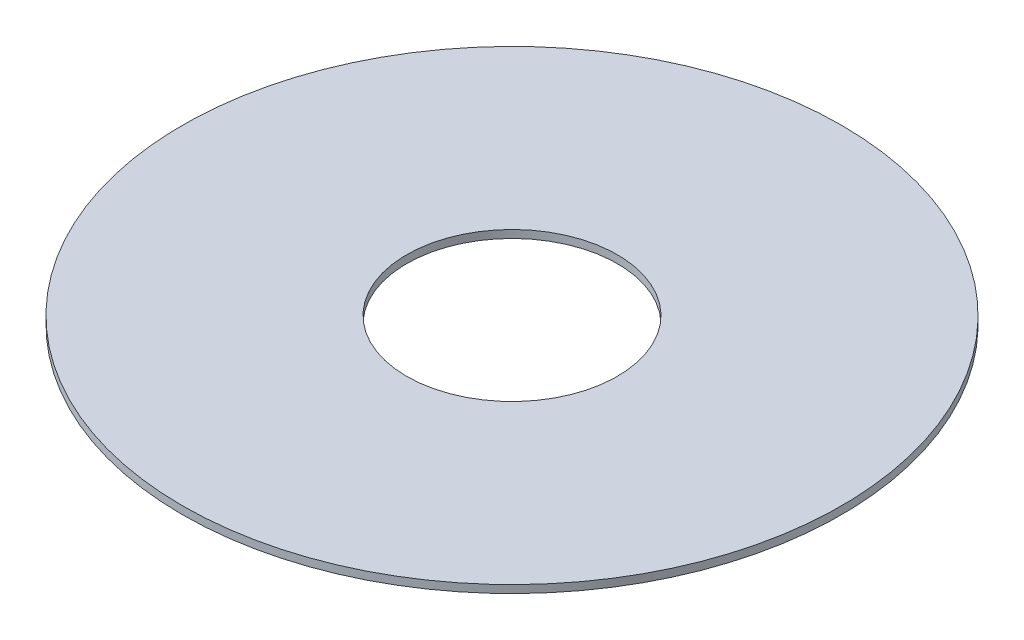
ISO-10303-21;
HEADER;
FILE_DESCRIPTION(('STEP AP214'),'2;1');
FILE_NAME('part.step','',(''),(''),'','','');
FILE_SCHEMA(('AUTOMOTIVE_DESIGN { 1 0 10303 214 1 1 1 1 }'));
ENDSEC;
DATA;
#1=APPLICATION_CONTEXT('core data for automotive mechanical design processes');
#2=APPLICATION_PROTOCOL_DEFINITION('international standard','automotive_design',2000,#1);
#3=PRODUCT_CONTEXT('',#1,'mechanical');
#4=PRODUCT('Part','Part','',(#3));
#5=PRODUCT_RELATED_PRODUCT_CATEGORY('part','',(#4));
#6=PRODUCT_DEFINITION_FORMATION('','',#4);
#7=PRODUCT_DEFINITION_CONTEXT('part definition',#1,'design');
#8=PRODUCT_DEFINITION('design','',#6,#7);
#9=PRODUCT_DEFINITION_SHAPE('','',#8);
#10=(LENGTH_UNIT() NAMED_UNIT(*) SI_UNIT(.MILLI.,.METRE.));
#11=(NAMED_UNIT(*) PLANE_ANGLE_UNIT() SI_UNIT($,.RADIAN.));
#12=(NAMED_UNIT(*) SI_UNIT($,.STERADIAN.) SOLID_ANGLE_UNIT());
#13=UNCERTAINTY_MEASURE_WITH_UNIT(LENGTH_MEASURE(1.E-05),#10,'distance_accuracy_value','');
#14=(GEOMETRIC_REPRESENTATION_CONTEXT(3) GLOBAL_UNCERTAINTY_ASSIGNED_CONTEXT((#13)) GLOBAL_UNIT_ASSIGNED_CONTEXT((#10,
#11,#12)) REPRESENTATION_CONTEXT('',''));
#15=CARTESIAN_POINT('',(0.,0.,0.));
#16=DIRECTION('',(0.,0.,1.));
#17=DIRECTION('',(1.,0.,0.));
#18=AXIS2_PLACEMENT_3D('',#15,#16,#17);
#19=CARTESIAN_POINT('',(0.,0.4,0.));
#20=DIRECTION('',(0.,1.,0.));
#21=DIRECTION('',(0.,0.,1.));
#22=AXIS2_PLACEMENT_3D('',#19,#20,#21);
#23=PLANE('',#22);
#24=CARTESIAN_POINT('',(0.,0.4,0.));
#25=DIRECTION('',(0.,1.,0.));
#26=DIRECTION('',(0.,0.,1.));
#27=AXIS2_PLACEMENT_3D('',#24,#25,#26);
#28=CIRCLE('',#27,16.92);
#29=CARTESIAN_POINT('',(0.,0.4,16.92));
#30=VERTEX_POINT('',#29);
#31=EDGE_CURVE('E10',#30,#30,#28,.T.);
#32=ORIENTED_EDGE('',*,*,#31,.T.);
#33=EDGE_LOOP('',(#32));
#34=FACE_BOUND('',#33,.T.);
#35=CARTESIAN_POINT('',(0.,0.4,0.));
#36=DIRECTION('',(0.,1.,0.));
#37=DIRECTION('',(0.,0.,1.));
#38=AXIS2_PLACEMENT_3D('',#35,#36,#37);
#39=CIRCLE('',#38,5.4101);
#40=CARTESIAN_POINT('',(0.,0.4,5.4101));
#41=VERTEX_POINT('',#40);
#42=EDGE_CURVE('E41',#41,#41,#39,.T.);
#43=ORIENTED_EDGE('',*,*,#42,.F.);
#44=EDGE_LOOP('',(#43));
#45=FACE_BOUND('',#44,.T.);
#46=ADVANCED_FACE('F30',(#34,#45),#23,.T.);
#47=CARTESIAN_POINT('',(0.,0.,0.));
#48=DIRECTION('',(0.,1.,0.));
#49=DIRECTION('',(0.,0.,1.));
#50=AXIS2_PLACEMENT_3D('',#47,#48,#49);
#51=PLANE('',#50);
#52=CARTESIAN_POINT('',(0.,0.,0.));
#53=DIRECTION('',(0.,1.,0.));
#54=DIRECTION('',(0.,0.,1.));
#55=AXIS2_PLACEMENT_3D('',#52,#53,#54);
#56=CIRCLE('',#55,16.92);
#57=CARTESIAN_POINT('',(0.,0.,16.92));
#58=VERTEX_POINT('',#57);
#59=EDGE_CURVE('E34',#58,#58,#56,.T.);
#60=ORIENTED_EDGE('',*,*,#59,.F.);
#61=EDGE_LOOP('',(#60));
#62=FACE_BOUND('',#61,.T.);
#63=CARTESIAN_POINT('',(0.,0.,0.));
#64=DIRECTION('',(0.,1.,0.));
#65=DIRECTION('',(0.,0.,1.));
#66=AXIS2_PLACEMENT_3D('',#63,#64,#65);
#67=CIRCLE('',#66,5.4101);
#68=CARTESIAN_POINT('',(0.,0.,5.4101));
#69=VERTEX_POINT('',#68);
#70=EDGE_CURVE('E43',#69,#69,#67,.T.);
#71=ORIENTED_EDGE('',*,*,#70,.T.);
#72=EDGE_LOOP('',(#71));
#73=FACE_BOUND('',#72,.T.);
#74=ADVANCED_FACE('F53',(#62,#73),#51,.F.);
#75=CARTESIAN_POINT('',(0.,0.4,0.));
#76=DIRECTION('',(0.,-1.,0.));
#77=DIRECTION('',(0.,0.,-1.));
#78=AXIS2_PLACEMENT_3D('',#75,#76,#77);
#79=CYLINDRICAL_SURFACE('',#78,16.92);
#80=ORIENTED_EDGE('',*,*,#31,.F.);
#81=EDGE_LOOP('',(#80));
#82=FACE_BOUND('',#81,.T.);
#83=ORIENTED_EDGE('',*,*,#59,.T.);
#84=EDGE_LOOP('',(#83));
#85=FACE_BOUND('',#84,.T.);
#86=ADVANCED_FACE('F32',(#82,#85),#79,.T.);
#87=CARTESIAN_POINT('',(0.,0.4,0.));
#88=DIRECTION('',(0.,-1.,0.));
#89=DIRECTION('',(0.,0.,-1.));
#90=AXIS2_PLACEMENT_3D('',#87,#88,#89);
#91=CYLINDRICAL_SURFACE('',#90,5.4101);
#92=ORIENTED_EDGE('',*,*,#42,.T.);
#93=EDGE_LOOP('',(#92));
#94=FACE_BOUND('',#93,.T.);
#95=ORIENTED_EDGE('',*,*,#70,.F.);
#96=EDGE_LOOP('',(#95));
#97=FACE_BOUND('',#96,.T.);
#98=ADVANCED_FACE('F49',(#94,#97),#91,.F.);
#99=CLOSED_SHELL('',(#46,#74,#86,#98));
#100=MANIFOLD_SOLID_BREP('B2',#99);
#101=ADVANCED_BREP_SHAPE_REPRESENTATION('',(#18,#100),#14);
#102=SHAPE_DEFINITION_REPRESENTATION(#9,#101);
ENDSEC;
END-ISO-10303-21;
